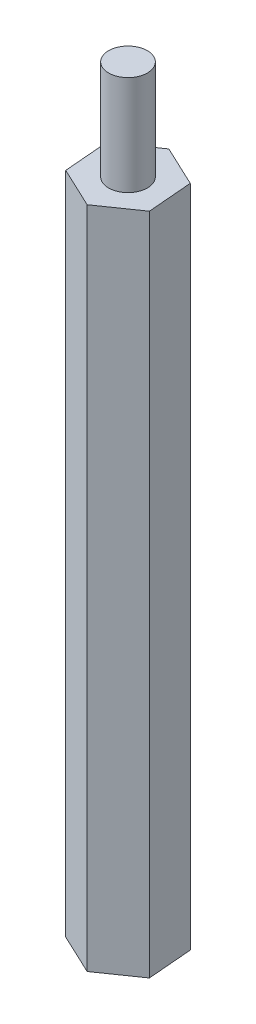
ISO-10303-21;
HEADER;
FILE_DESCRIPTION(('STEP AP214'),'2;1');
FILE_NAME('part.step','',(''),(''),'','','');
FILE_SCHEMA(('AUTOMOTIVE_DESIGN { 1 0 10303 214 1 1 1 1 }'));
ENDSEC;
DATA;
#1=APPLICATION_CONTEXT('core data for automotive mechanical design processes');
#2=APPLICATION_PROTOCOL_DEFINITION('international standard','automotive_design',2000,#1);
#3=PRODUCT_CONTEXT('',#1,'mechanical');
#4=PRODUCT('Part','Part','',(#3));
#5=PRODUCT_RELATED_PRODUCT_CATEGORY('part','',(#4));
#6=PRODUCT_DEFINITION_FORMATION('','',#4);
#7=PRODUCT_DEFINITION_CONTEXT('part definition',#1,'design');
#8=PRODUCT_DEFINITION('design','',#6,#7);
#9=PRODUCT_DEFINITION_SHAPE('','',#8);
#10=(LENGTH_UNIT() NAMED_UNIT(*) SI_UNIT(.MILLI.,.METRE.));
#11=(NAMED_UNIT(*) PLANE_ANGLE_UNIT() SI_UNIT($,.RADIAN.));
#12=(NAMED_UNIT(*) SI_UNIT($,.STERADIAN.) SOLID_ANGLE_UNIT());
#13=UNCERTAINTY_MEASURE_WITH_UNIT(LENGTH_MEASURE(1.E-05),#10,'distance_accuracy_value','');
#14=(GEOMETRIC_REPRESENTATION_CONTEXT(3) GLOBAL_UNCERTAINTY_ASSIGNED_CONTEXT((#13)) GLOBAL_UNIT_ASSIGNED_CONTEXT((#10,
#11,#12)) REPRESENTATION_CONTEXT('',''));
#15=CARTESIAN_POINT('',(0.,0.,0.));
#16=DIRECTION('',(0.,0.,1.));
#17=DIRECTION('',(1.,0.,0.));
#18=AXIS2_PLACEMENT_3D('',#15,#16,#17);
#19=CARTESIAN_POINT('',(0.335872232804666,60.,4.02747106464642));
#20=DIRECTION('',(-0.570242943456794,0.,-0.82147610156214));
#21=DIRECTION('',(-0.82147610156214,0.,0.570242943456794));
#22=AXIS2_PLACEMENT_3D('',#19,#20,#21);
#23=PLANE('',#22);
#24=DIRECTION('',(0.82147610156214,0.,-0.570242943456794));
#25=VECTOR('',#24,1.);
#26=CARTESIAN_POINT('',(0.335872232804666,0.,4.02747106464642));
#27=LINE('',#26,#25);
#28=CARTESIAN_POINT('',(0.335872232804666,0.,4.02747106464642));
#29=VERTEX_POINT('',#28);
#30=CARTESIAN_POINT('',(3.65582837139289,0.,1.72286164628857));
#31=VERTEX_POINT('',#30);
#32=EDGE_CURVE('E117',#29,#31,#27,.T.);
#33=ORIENTED_EDGE('',*,*,#32,.T.);
#34=DIRECTION('',(0.,-1.,0.));
#35=VECTOR('',#34,1.);
#36=CARTESIAN_POINT('',(3.65582837139289,60.,1.72286164628857));
#37=LINE('',#36,#35);
#38=CARTESIAN_POINT('',(3.65582837139289,60.,1.72286164628857));
#39=VERTEX_POINT('',#38);
#40=EDGE_CURVE('E11',#39,#31,#37,.T.);
#41=ORIENTED_EDGE('',*,*,#40,.F.);
#42=DIRECTION('',(0.82147610156214,0.,-0.570242943456794));
#43=VECTOR('',#42,1.);
#44=CARTESIAN_POINT('',(0.335872232804666,60.,4.02747106464642));
#45=LINE('',#44,#43);
#46=CARTESIAN_POINT('',(0.335872232804666,60.,4.02747106464642));
#47=VERTEX_POINT('',#46);
#48=EDGE_CURVE('E128',#47,#39,#45,.T.);
#49=ORIENTED_EDGE('',*,*,#48,.F.);
#50=DIRECTION('',(0.,-1.,0.));
#51=VECTOR('',#50,1.);
#52=CARTESIAN_POINT('',(0.335872232804666,60.,4.02747106464642));
#53=LINE('',#52,#51);
#54=EDGE_CURVE('E113',#47,#29,#53,.T.);
#55=ORIENTED_EDGE('',*,*,#54,.T.);
#56=EDGE_LOOP('',(#33,#41,#49,#55));
#57=FACE_BOUND('',#56,.T.);
#58=ADVANCED_FACE('F33',(#57),#23,.F.);
#59=CARTESIAN_POINT('',(3.65582837139289,60.,1.72286164628857));
#60=DIRECTION('',(-0.996540644283016,0.,0.0831068245813265));
#61=DIRECTION('',(0.0831068245813265,0.,0.996540644283016));
#62=AXIS2_PLACEMENT_3D('',#59,#60,#61);
#63=PLANE('',#62);
#64=DIRECTION('',(-0.0831068245813265,0.,-0.996540644283016));
#65=VECTOR('',#64,1.);
#66=CARTESIAN_POINT('',(3.65582837139289,0.,1.72286164628857));
#67=LINE('',#66,#65);
#68=CARTESIAN_POINT('',(3.31995613858822,0.,-2.30460941835785));
#69=VERTEX_POINT('',#68);
#70=EDGE_CURVE('E120',#31,#69,#67,.T.);
#71=ORIENTED_EDGE('',*,*,#70,.T.);
#72=DIRECTION('',(0.,-1.,0.));
#73=VECTOR('',#72,1.);
#74=CARTESIAN_POINT('',(3.31995613858822,60.,-2.30460941835785));
#75=LINE('',#74,#73);
#76=CARTESIAN_POINT('',(3.31995613858822,60.,-2.30460941835785));
#77=VERTEX_POINT('',#76);
#78=EDGE_CURVE('E41',#77,#69,#75,.T.);
#79=ORIENTED_EDGE('',*,*,#78,.F.);
#80=DIRECTION('',(-0.0831068245813265,0.,-0.996540644283016));
#81=VECTOR('',#80,1.);
#82=CARTESIAN_POINT('',(3.65582837139289,60.,1.72286164628857));
#83=LINE('',#82,#81);
#84=EDGE_CURVE('E86',#39,#77,#83,.T.);
#85=ORIENTED_EDGE('',*,*,#84,.F.);
#86=ORIENTED_EDGE('',*,*,#40,.T.);
#87=EDGE_LOOP('',(#71,#79,#85,#86));
#88=FACE_BOUND('',#87,.T.);
#89=ADVANCED_FACE('F153',(#88),#63,.F.);
#90=CARTESIAN_POINT('',(3.31995613858822,60.,-2.30460941835785));
#91=DIRECTION('',(-0.426297700826222,0.,0.904582926143467));
#92=DIRECTION('',(0.904582926143467,0.,0.426297700826223));
#93=AXIS2_PLACEMENT_3D('',#90,#91,#92);
#94=PLANE('',#93);
#95=DIRECTION('',(-0.904582926143467,0.,-0.426297700826222));
#96=VECTOR('',#95,1.);
#97=CARTESIAN_POINT('',(3.31995613858822,0.,-2.30460941835785));
#98=LINE('',#97,#96);
#99=CARTESIAN_POINT('',(-0.335872232804667,0.,-4.02747106464642));
#100=VERTEX_POINT('',#99);
#101=EDGE_CURVE('E123',#69,#100,#98,.T.);
#102=ORIENTED_EDGE('',*,*,#101,.T.);
#103=DIRECTION('',(0.,-1.,0.));
#104=VECTOR('',#103,1.);
#105=CARTESIAN_POINT('',(-0.335872232804667,60.,-4.02747106464642));
#106=LINE('',#105,#104);
#107=CARTESIAN_POINT('',(-0.335872232804667,60.,-4.02747106464642));
#108=VERTEX_POINT('',#107);
#109=EDGE_CURVE('E108',#108,#100,#106,.T.);
#110=ORIENTED_EDGE('',*,*,#109,.F.);
#111=DIRECTION('',(-0.904582926143467,0.,-0.426297700826222));
#112=VECTOR('',#111,1.);
#113=CARTESIAN_POINT('',(3.31995613858822,60.,-2.30460941835785));
#114=LINE('',#113,#112);
#115=EDGE_CURVE('E99',#77,#108,#114,.T.);
#116=ORIENTED_EDGE('',*,*,#115,.F.);
#117=ORIENTED_EDGE('',*,*,#78,.T.);
#118=EDGE_LOOP('',(#102,#110,#116,#117));
#119=FACE_BOUND('',#118,.T.);
#120=ADVANCED_FACE('F134',(#119),#94,.F.);
#121=CARTESIAN_POINT('',(-0.335872232804667,60.,-4.02747106464642));
#122=DIRECTION('',(0.570242943456794,0.,0.82147610156214));
#123=DIRECTION('',(0.82147610156214,0.,-0.570242943456794));
#124=AXIS2_PLACEMENT_3D('',#121,#122,#123);
#125=PLANE('',#124);
#126=DIRECTION('',(-0.82147610156214,0.,0.570242943456794));
#127=VECTOR('',#126,1.);
#128=CARTESIAN_POINT('',(-0.335872232804667,0.,-4.02747106464642));
#129=LINE('',#128,#127);
#130=CARTESIAN_POINT('',(-3.65582837139289,0.,-1.72286164628857));
#131=VERTEX_POINT('',#130);
#132=EDGE_CURVE('E107',#100,#131,#129,.T.);
#133=ORIENTED_EDGE('',*,*,#132,.T.);
#134=DIRECTION('',(0.,-1.,0.));
#135=VECTOR('',#134,1.);
#136=CARTESIAN_POINT('',(-3.65582837139289,60.,-1.72286164628857));
#137=LINE('',#136,#135);
#138=CARTESIAN_POINT('',(-3.65582837139289,60.,-1.72286164628857));
#139=VERTEX_POINT('',#138);
#140=EDGE_CURVE('E104',#139,#131,#137,.T.);
#141=ORIENTED_EDGE('',*,*,#140,.F.);
#142=DIRECTION('',(-0.82147610156214,0.,0.570242943456794));
#143=VECTOR('',#142,1.);
#144=CARTESIAN_POINT('',(-0.335872232804667,60.,-4.02747106464642));
#145=LINE('',#144,#143);
#146=EDGE_CURVE('E93',#108,#139,#145,.T.);
#147=ORIENTED_EDGE('',*,*,#146,.F.);
#148=ORIENTED_EDGE('',*,*,#109,.T.);
#149=EDGE_LOOP('',(#133,#141,#147,#148));
#150=FACE_BOUND('',#149,.T.);
#151=ADVANCED_FACE('F105',(#150),#125,.F.);
#152=CARTESIAN_POINT('',(-3.65582837139289,60.,-1.72286164628857));
#153=DIRECTION('',(0.996540644283016,0.,-0.0831068245813263));
#154=DIRECTION('',(-0.0831068245813263,0.,-0.996540644283016));
#155=AXIS2_PLACEMENT_3D('',#152,#153,#154);
#156=PLANE('',#155);
#157=DIRECTION('',(0.0831068245813263,0.,0.996540644283016));
#158=VECTOR('',#157,1.);
#159=CARTESIAN_POINT('',(-3.65582837139289,0.,-1.72286164628857));
#160=LINE('',#159,#158);
#161=CARTESIAN_POINT('',(-3.31995613858822,0.,2.30460941835785));
#162=VERTEX_POINT('',#161);
#163=EDGE_CURVE('E72',#131,#162,#160,.T.);
#164=ORIENTED_EDGE('',*,*,#163,.T.);
#165=DIRECTION('',(0.,-1.,0.));
#166=VECTOR('',#165,1.);
#167=CARTESIAN_POINT('',(-3.31995613858822,60.,2.30460941835785));
#168=LINE('',#167,#166);
#169=CARTESIAN_POINT('',(-3.31995613858822,60.,2.30460941835785));
#170=VERTEX_POINT('',#169);
#171=EDGE_CURVE('E109',#170,#162,#168,.T.);
#172=ORIENTED_EDGE('',*,*,#171,.F.);
#173=DIRECTION('',(0.0831068245813263,0.,0.996540644283016));
#174=VECTOR('',#173,1.);
#175=CARTESIAN_POINT('',(-3.65582837139289,60.,-1.72286164628857));
#176=LINE('',#175,#174);
#177=EDGE_CURVE('E97',#139,#170,#176,.T.);
#178=ORIENTED_EDGE('',*,*,#177,.F.);
#179=ORIENTED_EDGE('',*,*,#140,.T.);
#180=EDGE_LOOP('',(#164,#172,#178,#179));
#181=FACE_BOUND('',#180,.T.);
#182=ADVANCED_FACE('F111',(#181),#156,.F.);
#183=CARTESIAN_POINT('',(-3.31995613858822,60.,2.30460941835785));
#184=DIRECTION('',(0.426297700826223,0.,-0.904582926143467));
#185=DIRECTION('',(-0.904582926143467,0.,-0.426297700826223));
#186=AXIS2_PLACEMENT_3D('',#183,#184,#185);
#187=PLANE('',#186);
#188=DIRECTION('',(0.904582926143467,0.,0.426297700826223));
#189=VECTOR('',#188,1.);
#190=CARTESIAN_POINT('',(-3.31995613858822,0.,2.30460941835785));
#191=LINE('',#190,#189);
#192=EDGE_CURVE('E78',#162,#29,#191,.T.);
#193=ORIENTED_EDGE('',*,*,#192,.T.);
#194=ORIENTED_EDGE('',*,*,#54,.F.);
#195=DIRECTION('',(0.904582926143467,0.,0.426297700826223));
#196=VECTOR('',#195,1.);
#197=CARTESIAN_POINT('',(-3.31995613858822,60.,2.30460941835785));
#198=LINE('',#197,#196);
#199=EDGE_CURVE('E49',#170,#47,#198,.T.);
#200=ORIENTED_EDGE('',*,*,#199,.F.);
#201=ORIENTED_EDGE('',*,*,#171,.T.);
#202=EDGE_LOOP('',(#193,#194,#200,#201));
#203=FACE_BOUND('',#202,.T.);
#204=ADVANCED_FACE('F141',(#203),#187,.F.);
#205=CARTESIAN_POINT('',(0.,60.,0.));
#206=DIRECTION('',(0.,1.,0.));
#207=DIRECTION('',(0.,0.,1.));
#208=AXIS2_PLACEMENT_3D('',#205,#206,#207);
#209=PLANE('',#208);
#210=CARTESIAN_POINT('',(0.,60.,0.));
#211=DIRECTION('',(0.,1.,0.));
#212=DIRECTION('',(0.,0.,1.));
#213=AXIS2_PLACEMENT_3D('',#210,#211,#212);
#214=CIRCLE('',#213,1.75);
#215=CARTESIAN_POINT('',(0.,60.,1.75));
#216=VERTEX_POINT('',#215);
#217=EDGE_CURVE('E237',#216,#216,#214,.T.);
#218=ORIENTED_EDGE('',*,*,#217,.F.);
#219=EDGE_LOOP('',(#218));
#220=FACE_BOUND('',#219,.T.);
#221=ORIENTED_EDGE('',*,*,#48,.T.);
#222=ORIENTED_EDGE('',*,*,#84,.T.);
#223=ORIENTED_EDGE('',*,*,#115,.T.);
#224=ORIENTED_EDGE('',*,*,#146,.T.);
#225=ORIENTED_EDGE('',*,*,#177,.T.);
#226=ORIENTED_EDGE('',*,*,#199,.T.);
#227=EDGE_LOOP('',(#221,#222,#223,#224,#225,#226));
#228=FACE_BOUND('',#227,.T.);
#229=ADVANCED_FACE('F95',(#220,#228),#209,.T.);
#230=CARTESIAN_POINT('',(0.,0.,0.));
#231=DIRECTION('',(0.,1.,0.));
#232=DIRECTION('',(0.,0.,1.));
#233=AXIS2_PLACEMENT_3D('',#230,#231,#232);
#234=PLANE('',#233);
#235=CARTESIAN_POINT('',(0.,0.,0.));
#236=DIRECTION('',(0.,-1.,0.));
#237=DIRECTION('',(0.,0.,-1.));
#238=AXIS2_PLACEMENT_3D('',#235,#236,#237);
#239=CIRCLE('',#238,2.);
#240=CARTESIAN_POINT('',(0.,0.,-2.));
#241=VERTEX_POINT('',#240);
#242=EDGE_CURVE('E236',#241,#241,#239,.T.);
#243=ORIENTED_EDGE('',*,*,#242,.F.);
#244=EDGE_LOOP('',(#243));
#245=FACE_BOUND('',#244,.T.);
#246=ORIENTED_EDGE('',*,*,#32,.F.);
#247=ORIENTED_EDGE('',*,*,#192,.F.);
#248=ORIENTED_EDGE('',*,*,#163,.F.);
#249=ORIENTED_EDGE('',*,*,#132,.F.);
#250=ORIENTED_EDGE('',*,*,#101,.F.);
#251=ORIENTED_EDGE('',*,*,#70,.F.);
#252=EDGE_LOOP('',(#246,#247,#248,#249,#250,#251));
#253=FACE_BOUND('',#252,.T.);
#254=ADVANCED_FACE('F137',(#245,#253),#234,.F.);
#255=CARTESIAN_POINT('',(0.,10.,0.));
#256=DIRECTION('',(0.,-1.,0.));
#257=DIRECTION('',(0.,0.,-1.));
#258=AXIS2_PLACEMENT_3D('',#255,#256,#257);
#259=CYLINDRICAL_SURFACE('',#258,2.);
#260=CARTESIAN_POINT('',(0.,10.,0.));
#261=DIRECTION('',(0.,-1.,0.));
#262=DIRECTION('',(0.,0.,-1.));
#263=AXIS2_PLACEMENT_3D('',#260,#261,#262);
#264=CIRCLE('',#263,2.);
#265=CARTESIAN_POINT('',(0.,10.,-2.));
#266=VERTEX_POINT('',#265);
#267=EDGE_CURVE('E121',#266,#266,#264,.T.);
#268=ORIENTED_EDGE('',*,*,#267,.F.);
#269=EDGE_LOOP('',(#268));
#270=FACE_BOUND('',#269,.T.);
#271=ORIENTED_EDGE('',*,*,#242,.T.);
#272=EDGE_LOOP('',(#271));
#273=FACE_BOUND('',#272,.T.);
#274=ADVANCED_FACE('F185',(#270,#273),#259,.F.);
#275=CARTESIAN_POINT('',(0.,10.,0.));
#276=DIRECTION('',(0.,-1.,0.));
#277=DIRECTION('',(0.,0.,-1.));
#278=AXIS2_PLACEMENT_3D('',#275,#276,#277);
#279=PLANE('',#278);
#280=ORIENTED_EDGE('',*,*,#267,.T.);
#281=EDGE_LOOP('',(#280));
#282=FACE_BOUND('',#281,.T.);
#283=ADVANCED_FACE('F194',(#282),#279,.T.);
#284=CARTESIAN_POINT('',(0.,69.,0.));
#285=DIRECTION('',(0.,-1.,0.));
#286=DIRECTION('',(0.,0.,-1.));
#287=AXIS2_PLACEMENT_3D('',#284,#285,#286);
#288=CYLINDRICAL_SURFACE('',#287,1.75);
#289=CARTESIAN_POINT('',(0.,69.,0.));
#290=DIRECTION('',(0.,1.,0.));
#291=DIRECTION('',(0.,0.,1.));
#292=AXIS2_PLACEMENT_3D('',#289,#290,#291);
#293=CIRCLE('',#292,1.75);
#294=CARTESIAN_POINT('',(0.,69.,1.75));
#295=VERTEX_POINT('',#294);
#296=EDGE_CURVE('E235',#295,#295,#293,.T.);
#297=ORIENTED_EDGE('',*,*,#296,.F.);
#298=EDGE_LOOP('',(#297));
#299=FACE_BOUND('',#298,.T.);
#300=ORIENTED_EDGE('',*,*,#217,.T.);
#301=EDGE_LOOP('',(#300));
#302=FACE_BOUND('',#301,.T.);
#303=ADVANCED_FACE('F204',(#299,#302),#288,.T.);
#304=CARTESIAN_POINT('',(0.,69.,0.));
#305=DIRECTION('',(0.,1.,0.));
#306=DIRECTION('',(0.,0.,1.));
#307=AXIS2_PLACEMENT_3D('',#304,#305,#306);
#308=PLANE('',#307);
#309=ORIENTED_EDGE('',*,*,#296,.T.);
#310=EDGE_LOOP('',(#309));
#311=FACE_BOUND('',#310,.T.);
#312=ADVANCED_FACE('F219',(#311),#308,.T.);
#313=CLOSED_SHELL('',(#58,#89,#120,#151,#182,#204,#229,#254,#274,#283,#303,#312));
#314=MANIFOLD_SOLID_BREP('B2',#313);
#315=ADVANCED_BREP_SHAPE_REPRESENTATION('',(#18,#314),#14);
#316=SHAPE_DEFINITION_REPRESENTATION(#9,#315);
ENDSEC;
END-ISO-10303-21;
